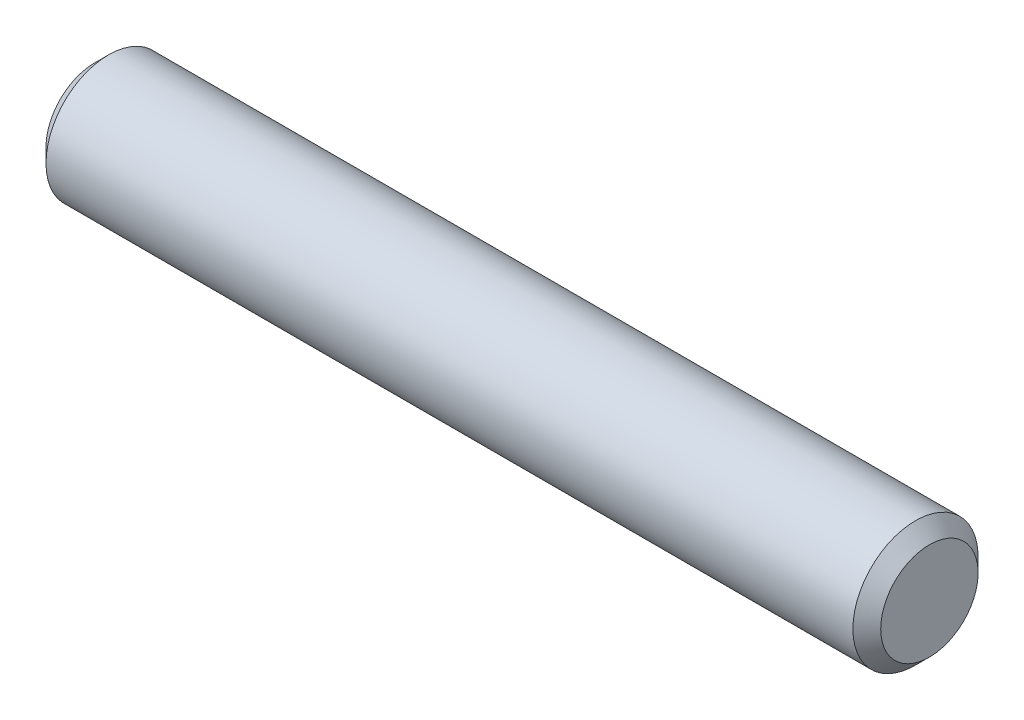
ISO-10303-21;
HEADER;
FILE_DESCRIPTION(('STEP AP214'),'2;1');
FILE_NAME('part.step','',(''),(''),'','','');
FILE_SCHEMA(('AUTOMOTIVE_DESIGN { 1 0 10303 214 1 1 1 1 }'));
ENDSEC;
DATA;
#1=APPLICATION_CONTEXT('core data for automotive mechanical design processes');
#2=APPLICATION_PROTOCOL_DEFINITION('international standard','automotive_design',2000,#1);
#3=PRODUCT_CONTEXT('',#1,'mechanical');
#4=PRODUCT('Part','Part','',(#3));
#5=PRODUCT_RELATED_PRODUCT_CATEGORY('part','',(#4));
#6=PRODUCT_DEFINITION_FORMATION('','',#4);
#7=PRODUCT_DEFINITION_CONTEXT('part definition',#1,'design');
#8=PRODUCT_DEFINITION('design','',#6,#7);
#9=PRODUCT_DEFINITION_SHAPE('','',#8);
#10=(LENGTH_UNIT() NAMED_UNIT(*) SI_UNIT(.MILLI.,.METRE.));
#11=(NAMED_UNIT(*) PLANE_ANGLE_UNIT() SI_UNIT($,.RADIAN.));
#12=(NAMED_UNIT(*) SI_UNIT($,.STERADIAN.) SOLID_ANGLE_UNIT());
#13=UNCERTAINTY_MEASURE_WITH_UNIT(LENGTH_MEASURE(1.E-05),#10,'distance_accuracy_value','');
#14=(GEOMETRIC_REPRESENTATION_CONTEXT(3) GLOBAL_UNCERTAINTY_ASSIGNED_CONTEXT((#13)) GLOBAL_UNIT_ASSIGNED_CONTEXT((#10,
#11,#12)) REPRESENTATION_CONTEXT('',''));
#15=CARTESIAN_POINT('',(0.,0.,0.));
#16=DIRECTION('',(0.,0.,1.));
#17=DIRECTION('',(1.,0.,0.));
#18=AXIS2_PLACEMENT_3D('',#15,#16,#17);
#19=CARTESIAN_POINT('',(-5.34269662921348,0.,0.));
#20=DIRECTION('',(1.,0.,0.));
#21=DIRECTION('',(0.,0.,-1.));
#22=AXIS2_PLACEMENT_3D('',#19,#20,#21);
#23=PLANE('',#22);
#24=CARTESIAN_POINT('',(-5.34269662921348,0.,0.));
#25=DIRECTION('',(1.,0.,0.));
#26=DIRECTION('',(0.,0.,-1.));
#27=AXIS2_PLACEMENT_3D('',#24,#25,#26);
#28=CIRCLE('',#27,0.700000000000001);
#29=CARTESIAN_POINT('',(-5.34269662921348,0.,-0.700000000000001));
#30=VERTEX_POINT('',#29);
#31=EDGE_CURVE('E52',#30,#30,#28,.F.);
#32=ORIENTED_EDGE('',*,*,#31,.T.);
#33=EDGE_LOOP('',(#32));
#34=FACE_BOUND('',#33,.T.);
#35=ADVANCED_FACE('F37',(#34),#23,.F.);
#36=CARTESIAN_POINT('',(-6.32022471910112,0.,0.));
#37=DIRECTION('',(-1.,0.,0.));
#38=DIRECTION('',(0.,0.,1.));
#39=AXIS2_PLACEMENT_3D('',#36,#37,#38);
#40=CYLINDRICAL_SURFACE('',#39,0.9);
#41=CARTESIAN_POINT('',(-5.14269662921348,0.,0.));
#42=DIRECTION('',(1.,0.,0.));
#43=DIRECTION('',(0.,0.,-1.));
#44=AXIS2_PLACEMENT_3D('',#41,#42,#43);
#45=CIRCLE('',#44,0.9);
#46=CARTESIAN_POINT('',(-5.14269662921348,0.,-0.9));
#47=VERTEX_POINT('',#46);
#48=EDGE_CURVE('E44',#47,#47,#45,.T.);
#49=ORIENTED_EDGE('',*,*,#48,.T.);
#50=EDGE_LOOP('',(#49));
#51=FACE_BOUND('',#50,.T.);
#52=CARTESIAN_POINT('',(6.45730337078652,0.,0.));
#53=DIRECTION('',(-1.,0.,0.));
#54=DIRECTION('',(0.,0.,1.));
#55=AXIS2_PLACEMENT_3D('',#52,#53,#54);
#56=CIRCLE('',#55,0.9);
#57=CARTESIAN_POINT('',(6.45730337078652,0.,0.9));
#58=VERTEX_POINT('',#57);
#59=EDGE_CURVE('E48',#58,#58,#56,.T.);
#60=ORIENTED_EDGE('',*,*,#59,.T.);
#61=EDGE_LOOP('',(#60));
#62=FACE_BOUND('',#61,.T.);
#63=ADVANCED_FACE('F68',(#51,#62),#40,.T.);
#64=CARTESIAN_POINT('',(6.65730337078652,0.9,0.));
#65=DIRECTION('',(-1.,0.,0.));
#66=DIRECTION('',(0.,0.,1.));
#67=AXIS2_PLACEMENT_3D('',#64,#65,#66);
#68=PLANE('',#67);
#69=CARTESIAN_POINT('',(6.65730337078652,0.,0.));
#70=DIRECTION('',(-1.,0.,0.));
#71=DIRECTION('',(0.,0.,1.));
#72=AXIS2_PLACEMENT_3D('',#69,#70,#71);
#73=CIRCLE('',#72,0.700000000000001);
#74=CARTESIAN_POINT('',(6.65730337078652,0.,0.700000000000001));
#75=VERTEX_POINT('',#74);
#76=EDGE_CURVE('E10',#75,#75,#73,.F.);
#77=ORIENTED_EDGE('',*,*,#76,.T.);
#78=EDGE_LOOP('',(#77));
#79=FACE_BOUND('',#78,.T.);
#80=ADVANCED_FACE('F61',(#79),#68,.F.);
#81=CARTESIAN_POINT('',(-5.34269662921348,0.,0.));
#82=DIRECTION('',(1.,0.,0.));
#83=DIRECTION('',(0.,0.,-1.));
#84=AXIS2_PLACEMENT_3D('',#81,#82,#83);
#85=CONICAL_SURFACE('',#84,0.700000000000001,0.785398163397445);
#86=ORIENTED_EDGE('',*,*,#48,.F.);
#87=EDGE_LOOP('',(#86));
#88=FACE_BOUND('',#87,.T.);
#89=ORIENTED_EDGE('',*,*,#31,.F.);
#90=EDGE_LOOP('',(#89));
#91=FACE_BOUND('',#90,.T.);
#92=ADVANCED_FACE('F59',(#88,#91),#85,.T.);
#93=CARTESIAN_POINT('',(6.45730337078652,0.,0.));
#94=DIRECTION('',(-1.,0.,0.));
#95=DIRECTION('',(0.,0.,1.));
#96=AXIS2_PLACEMENT_3D('',#93,#94,#95);
#97=CONICAL_SURFACE('',#96,0.9,0.785398163397449);
#98=ORIENTED_EDGE('',*,*,#76,.F.);
#99=EDGE_LOOP('',(#98));
#100=FACE_BOUND('',#99,.T.);
#101=ORIENTED_EDGE('',*,*,#59,.F.);
#102=EDGE_LOOP('',(#101));
#103=FACE_BOUND('',#102,.T.);
#104=ADVANCED_FACE('F39',(#100,#103),#97,.T.);
#105=CLOSED_SHELL('',(#35,#63,#80,#92,#104));
#106=MANIFOLD_SOLID_BREP('B2',#105);
#107=ADVANCED_BREP_SHAPE_REPRESENTATION('',(#18,#106),#14);
#108=SHAPE_DEFINITION_REPRESENTATION(#9,#107);
ENDSEC;
END-ISO-10303-21;
